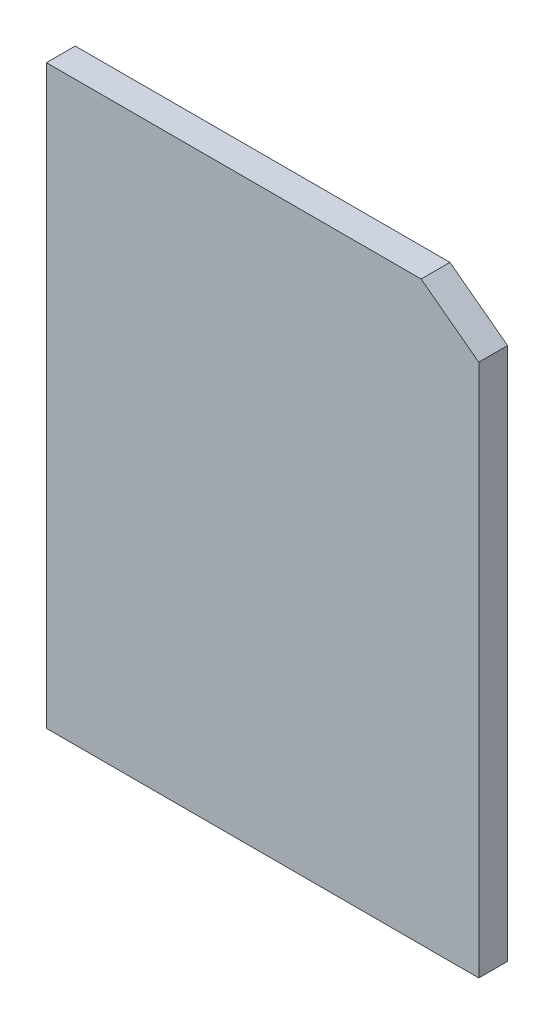
ISO-10303-21;
HEADER;
FILE_DESCRIPTION(('STEP AP214'),'2;1');
FILE_NAME('part.step','',(''),(''),'','','');
FILE_SCHEMA(('AUTOMOTIVE_DESIGN { 1 0 10303 214 1 1 1 1 }'));
ENDSEC;
DATA;
#1=APPLICATION_CONTEXT('core data for automotive mechanical design processes');
#2=APPLICATION_PROTOCOL_DEFINITION('international standard','automotive_design',2000,#1);
#3=PRODUCT_CONTEXT('',#1,'mechanical');
#4=PRODUCT('Part','Part','',(#3));
#5=PRODUCT_RELATED_PRODUCT_CATEGORY('part','',(#4));
#6=PRODUCT_DEFINITION_FORMATION('','',#4);
#7=PRODUCT_DEFINITION_CONTEXT('part definition',#1,'design');
#8=PRODUCT_DEFINITION('design','',#6,#7);
#9=PRODUCT_DEFINITION_SHAPE('','',#8);
#10=(LENGTH_UNIT() NAMED_UNIT(*) SI_UNIT(.MILLI.,.METRE.));
#11=(NAMED_UNIT(*) PLANE_ANGLE_UNIT() SI_UNIT($,.RADIAN.));
#12=(NAMED_UNIT(*) SI_UNIT($,.STERADIAN.) SOLID_ANGLE_UNIT());
#13=UNCERTAINTY_MEASURE_WITH_UNIT(LENGTH_MEASURE(1.E-05),#10,'distance_accuracy_value','');
#14=(GEOMETRIC_REPRESENTATION_CONTEXT(3) GLOBAL_UNCERTAINTY_ASSIGNED_CONTEXT((#13)) GLOBAL_UNIT_ASSIGNED_CONTEXT((#10,
#11,#12)) REPRESENTATION_CONTEXT('',''));
#15=CARTESIAN_POINT('',(0.,0.,0.));
#16=DIRECTION('',(0.,0.,1.));
#17=DIRECTION('',(1.,0.,0.));
#18=AXIS2_PLACEMENT_3D('',#15,#16,#17);
#19=CARTESIAN_POINT('',(-3.68067226890756,2.05210084033613,0.4));
#20=DIRECTION('',(0.,-1.,0.));
#21=DIRECTION('',(0.,0.,-1.));
#22=AXIS2_PLACEMENT_3D('',#19,#20,#21);
#23=PLANE('',#22);
#24=DIRECTION('',(-1.,0.,0.));
#25=VECTOR('',#24,1.);
#26=CARTESIAN_POINT('',(-3.68067226890756,2.05210084033613,0.));
#27=LINE('',#26,#25);
#28=CARTESIAN_POINT('',(1.51932773109244,2.05210084033613,0.));
#29=VERTEX_POINT('',#28);
#30=CARTESIAN_POINT('',(-3.68067226890756,2.05210084033613,0.));
#31=VERTEX_POINT('',#30);
#32=EDGE_CURVE('E122',#29,#31,#27,.T.);
#33=ORIENTED_EDGE('',*,*,#32,.T.);
#34=DIRECTION('',(0.,0.,-1.));
#35=VECTOR('',#34,1.);
#36=CARTESIAN_POINT('',(-3.68067226890756,2.05210084033613,0.4));
#37=LINE('',#36,#35);
#38=CARTESIAN_POINT('',(-3.68067226890756,2.05210084033613,0.4));
#39=VERTEX_POINT('',#38);
#40=EDGE_CURVE('E11',#39,#31,#37,.T.);
#41=ORIENTED_EDGE('',*,*,#40,.F.);
#42=DIRECTION('',(-1.,0.,0.));
#43=VECTOR('',#42,1.);
#44=CARTESIAN_POINT('',(-3.68067226890756,2.05210084033613,0.4));
#45=LINE('',#44,#43);
#46=CARTESIAN_POINT('',(1.51932773109244,2.05210084033613,0.4));
#47=VERTEX_POINT('',#46);
#48=EDGE_CURVE('E135',#47,#39,#45,.T.);
#49=ORIENTED_EDGE('',*,*,#48,.F.);
#50=DIRECTION('',(0.,0.,-1.));
#51=VECTOR('',#50,1.);
#52=CARTESIAN_POINT('',(1.51932773109244,2.05210084033613,0.4));
#53=LINE('',#52,#51);
#54=EDGE_CURVE('E118',#47,#29,#53,.T.);
#55=ORIENTED_EDGE('',*,*,#54,.T.);
#56=EDGE_LOOP('',(#33,#41,#49,#55));
#57=FACE_BOUND('',#56,.T.);
#58=ADVANCED_FACE('F43',(#57),#23,.F.);
#59=CARTESIAN_POINT('',(-3.68067226890756,2.05210084033613,0.4));
#60=DIRECTION('',(1.,0.,0.));
#61=DIRECTION('',(0.,1.,0.));
#62=AXIS2_PLACEMENT_3D('',#59,#60,#61);
#63=PLANE('',#62);
#64=DIRECTION('',(0.,-1.,0.));
#65=VECTOR('',#64,1.);
#66=CARTESIAN_POINT('',(-3.68067226890756,2.05210084033613,0.));
#67=LINE('',#66,#65);
#68=CARTESIAN_POINT('',(-3.68067226890756,-5.94789915966386,0.));
#69=VERTEX_POINT('',#68);
#70=EDGE_CURVE('E126',#31,#69,#67,.T.);
#71=ORIENTED_EDGE('',*,*,#70,.T.);
#72=DIRECTION('',(0.,0.,-1.));
#73=VECTOR('',#72,1.);
#74=CARTESIAN_POINT('',(-3.68067226890756,-5.94789915966386,0.4));
#75=LINE('',#74,#73);
#76=CARTESIAN_POINT('',(-3.68067226890756,-5.94789915966386,0.4));
#77=VERTEX_POINT('',#76);
#78=EDGE_CURVE('E52',#77,#69,#75,.T.);
#79=ORIENTED_EDGE('',*,*,#78,.F.);
#80=DIRECTION('',(0.,-1.,0.));
#81=VECTOR('',#80,1.);
#82=CARTESIAN_POINT('',(-3.68067226890756,2.05210084033613,0.4));
#83=LINE('',#82,#81);
#84=EDGE_CURVE('E94',#39,#77,#83,.T.);
#85=ORIENTED_EDGE('',*,*,#84,.F.);
#86=ORIENTED_EDGE('',*,*,#40,.T.);
#87=EDGE_LOOP('',(#71,#79,#85,#86));
#88=FACE_BOUND('',#87,.T.);
#89=ADVANCED_FACE('F157',(#88),#63,.F.);
#90=CARTESIAN_POINT('',(-3.68067226890756,-5.94789915966386,0.4));
#91=DIRECTION('',(0.,1.,0.));
#92=DIRECTION('',(0.,0.,1.));
#93=AXIS2_PLACEMENT_3D('',#90,#91,#92);
#94=PLANE('',#93);
#95=DIRECTION('',(1.,0.,0.));
#96=VECTOR('',#95,1.);
#97=CARTESIAN_POINT('',(-3.68067226890756,-5.94789915966386,0.));
#98=LINE('',#97,#96);
#99=CARTESIAN_POINT('',(2.31932773109244,-5.94789915966386,0.));
#100=VERTEX_POINT('',#99);
#101=EDGE_CURVE('E110',#69,#100,#98,.T.);
#102=ORIENTED_EDGE('',*,*,#101,.T.);
#103=DIRECTION('',(0.,0.,-1.));
#104=VECTOR('',#103,1.);
#105=CARTESIAN_POINT('',(2.31932773109244,-5.94789915966386,0.4));
#106=LINE('',#105,#104);
#107=CARTESIAN_POINT('',(2.31932773109244,-5.94789915966386,0.4));
#108=VERTEX_POINT('',#107);
#109=EDGE_CURVE('E107',#108,#100,#106,.T.);
#110=ORIENTED_EDGE('',*,*,#109,.F.);
#111=DIRECTION('',(1.,0.,0.));
#112=VECTOR('',#111,1.);
#113=CARTESIAN_POINT('',(-3.68067226890756,-5.94789915966386,0.4));
#114=LINE('',#113,#112);
#115=EDGE_CURVE('E98',#77,#108,#114,.T.);
#116=ORIENTED_EDGE('',*,*,#115,.F.);
#117=ORIENTED_EDGE('',*,*,#78,.T.);
#118=EDGE_LOOP('',(#102,#110,#116,#117));
#119=FACE_BOUND('',#118,.T.);
#120=ADVANCED_FACE('F108',(#119),#94,.F.);
#121=CARTESIAN_POINT('',(2.31932773109244,1.45210084033613,0.4));
#122=DIRECTION('',(-1.,0.,0.));
#123=DIRECTION('',(0.,-1.,0.));
#124=AXIS2_PLACEMENT_3D('',#121,#122,#123);
#125=PLANE('',#124);
#126=DIRECTION('',(0.,1.,0.));
#127=VECTOR('',#126,1.);
#128=CARTESIAN_POINT('',(2.31932773109244,1.45210084033613,0.));
#129=LINE('',#128,#127);
#130=CARTESIAN_POINT('',(2.31932773109244,1.45210084033613,0.));
#131=VERTEX_POINT('',#130);
#132=EDGE_CURVE('E80',#100,#131,#129,.T.);
#133=ORIENTED_EDGE('',*,*,#132,.T.);
#134=DIRECTION('',(0.,0.,-1.));
#135=VECTOR('',#134,1.);
#136=CARTESIAN_POINT('',(2.31932773109244,1.45210084033613,0.4));
#137=LINE('',#136,#135);
#138=CARTESIAN_POINT('',(2.31932773109244,1.45210084033613,0.4));
#139=VERTEX_POINT('',#138);
#140=EDGE_CURVE('E112',#139,#131,#137,.T.);
#141=ORIENTED_EDGE('',*,*,#140,.F.);
#142=DIRECTION('',(0.,1.,0.));
#143=VECTOR('',#142,1.);
#144=CARTESIAN_POINT('',(2.31932773109244,1.45210084033613,0.4));
#145=LINE('',#144,#143);
#146=EDGE_CURVE('E102',#108,#139,#145,.T.);
#147=ORIENTED_EDGE('',*,*,#146,.F.);
#148=ORIENTED_EDGE('',*,*,#109,.T.);
#149=EDGE_LOOP('',(#133,#141,#147,#148));
#150=FACE_BOUND('',#149,.T.);
#151=ADVANCED_FACE('F114',(#150),#125,.F.);
#152=CARTESIAN_POINT('',(2.31932773109244,1.45210084033613,0.4));
#153=DIRECTION('',(-0.6,-0.8,0.));
#154=DIRECTION('',(0.8,-0.6,0.));
#155=AXIS2_PLACEMENT_3D('',#152,#153,#154);
#156=PLANE('',#155);
#157=DIRECTION('',(-0.8,0.6,0.));
#158=VECTOR('',#157,1.);
#159=CARTESIAN_POINT('',(2.31932773109244,1.45210084033613,0.));
#160=LINE('',#159,#158);
#161=EDGE_CURVE('E86',#131,#29,#160,.T.);
#162=ORIENTED_EDGE('',*,*,#161,.T.);
#163=ORIENTED_EDGE('',*,*,#54,.F.);
#164=DIRECTION('',(-0.8,0.6,0.));
#165=VECTOR('',#164,1.);
#166=CARTESIAN_POINT('',(2.31932773109244,1.45210084033613,0.4));
#167=LINE('',#166,#165);
#168=EDGE_CURVE('E60',#139,#47,#167,.T.);
#169=ORIENTED_EDGE('',*,*,#168,.F.);
#170=ORIENTED_EDGE('',*,*,#140,.T.);
#171=EDGE_LOOP('',(#162,#163,#169,#170));
#172=FACE_BOUND('',#171,.T.);
#173=ADVANCED_FACE('F146',(#172),#156,.F.);
#174=CARTESIAN_POINT('',(0.,0.,0.4));
#175=DIRECTION('',(0.,0.,-1.));
#176=DIRECTION('',(-1.,0.,0.));
#177=AXIS2_PLACEMENT_3D('',#174,#175,#176);
#178=PLANE('',#177);
#179=ORIENTED_EDGE('',*,*,#48,.T.);
#180=ORIENTED_EDGE('',*,*,#84,.T.);
#181=ORIENTED_EDGE('',*,*,#115,.T.);
#182=ORIENTED_EDGE('',*,*,#146,.T.);
#183=ORIENTED_EDGE('',*,*,#168,.T.);
#184=EDGE_LOOP('',(#179,#180,#181,#182,#183));
#185=FACE_BOUND('',#184,.T.);
#186=ADVANCED_FACE('F100',(#185),#178,.F.);
#187=CARTESIAN_POINT('',(0.,0.,0.));
#188=DIRECTION('',(0.,0.,-1.));
#189=DIRECTION('',(-1.,0.,0.));
#190=AXIS2_PLACEMENT_3D('',#187,#188,#189);
#191=PLANE('',#190);
#192=ORIENTED_EDGE('',*,*,#32,.F.);
#193=ORIENTED_EDGE('',*,*,#161,.F.);
#194=ORIENTED_EDGE('',*,*,#132,.F.);
#195=ORIENTED_EDGE('',*,*,#101,.F.);
#196=ORIENTED_EDGE('',*,*,#70,.F.);
#197=EDGE_LOOP('',(#192,#193,#194,#195,#196));
#198=FACE_BOUND('',#197,.T.);
#199=ADVANCED_FACE('F142',(#198),#191,.T.);
#200=CLOSED_SHELL('',(#58,#89,#120,#151,#173,#186,#199));
#201=MANIFOLD_SOLID_BREP('B2',#200);
#202=ADVANCED_BREP_SHAPE_REPRESENTATION('',(#18,#201),#14);
#203=SHAPE_DEFINITION_REPRESENTATION(#9,#202);
ENDSEC;
END-ISO-10303-21;
